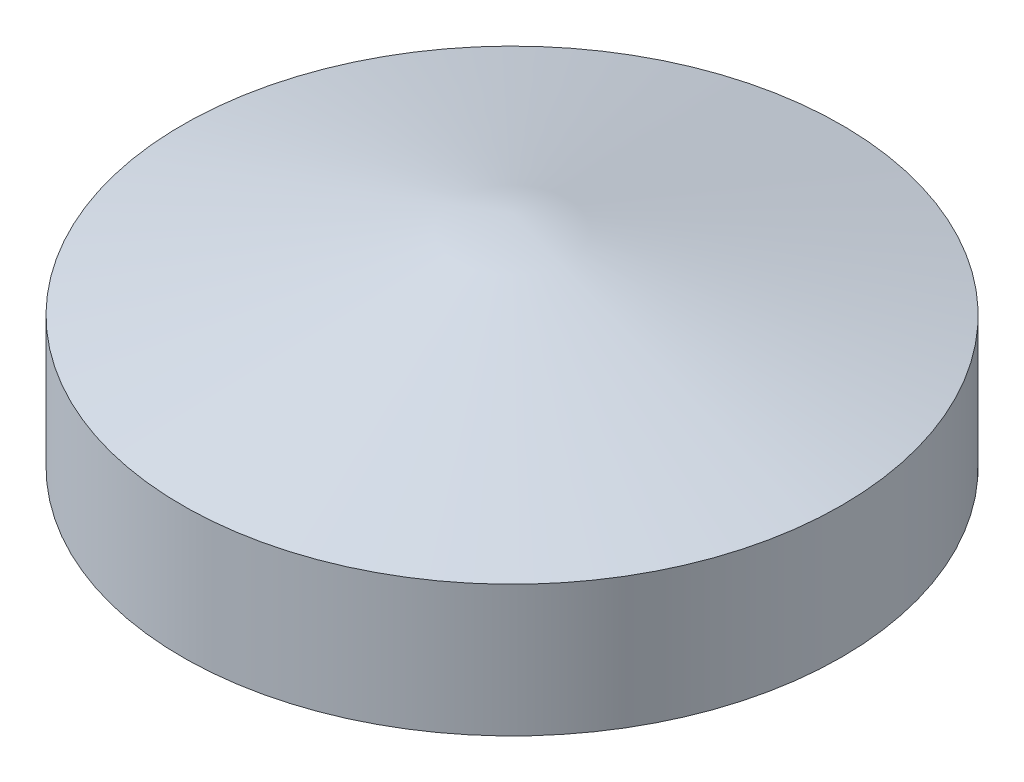
ISO-10303-21;
HEADER;
FILE_DESCRIPTION(('STEP AP214'),'2;1');
FILE_NAME('part.step','',(''),(''),'','','');
FILE_SCHEMA(('AUTOMOTIVE_DESIGN { 1 0 10303 214 1 1 1 1 }'));
ENDSEC;
DATA;
#1=APPLICATION_CONTEXT('core data for automotive mechanical design processes');
#2=APPLICATION_PROTOCOL_DEFINITION('international standard','automotive_design',2000,#1);
#3=PRODUCT_CONTEXT('',#1,'mechanical');
#4=PRODUCT('Part','Part','',(#3));
#5=PRODUCT_RELATED_PRODUCT_CATEGORY('part','',(#4));
#6=PRODUCT_DEFINITION_FORMATION('','',#4);
#7=PRODUCT_DEFINITION_CONTEXT('part definition',#1,'design');
#8=PRODUCT_DEFINITION('design','',#6,#7);
#9=PRODUCT_DEFINITION_SHAPE('','',#8);
#10=(LENGTH_UNIT() NAMED_UNIT(*) SI_UNIT(.MILLI.,.METRE.));
#11=(NAMED_UNIT(*) PLANE_ANGLE_UNIT() SI_UNIT($,.RADIAN.));
#12=(NAMED_UNIT(*) SI_UNIT($,.STERADIAN.) SOLID_ANGLE_UNIT());
#13=UNCERTAINTY_MEASURE_WITH_UNIT(LENGTH_MEASURE(1.E-05),#10,'distance_accuracy_value','');
#14=(GEOMETRIC_REPRESENTATION_CONTEXT(3) GLOBAL_UNCERTAINTY_ASSIGNED_CONTEXT((#13)) GLOBAL_UNIT_ASSIGNED_CONTEXT((#10,
#11,#12)) REPRESENTATION_CONTEXT('',''));
#15=CARTESIAN_POINT('',(0.,0.,0.));
#16=DIRECTION('',(0.,0.,1.));
#17=DIRECTION('',(1.,0.,0.));
#18=AXIS2_PLACEMENT_3D('',#15,#16,#17);
#19=CARTESIAN_POINT('',(0.,0.,0.));
#20=DIRECTION('',(0.,-1.,0.));
#21=DIRECTION('',(1.,0.,0.));
#22=AXIS2_PLACEMENT_3D('',#19,#20,#21);
#23=CYLINDRICAL_SURFACE('',#22,9.00000000000001);
#24=CARTESIAN_POINT('',(0.,1.17691453623971,0.));
#25=DIRECTION('',(0.,-1.,0.));
#26=DIRECTION('',(1.,0.,0.));
#27=AXIS2_PLACEMENT_3D('',#24,#25,#26);
#28=CIRCLE('',#27,9.);
#29=CARTESIAN_POINT('',(9.,1.17691453623971,0.));
#30=VERTEX_POINT('',#29);
#31=EDGE_CURVE('E44',#30,#30,#28,.T.);
#32=ORIENTED_EDGE('',*,*,#31,.T.);
#33=EDGE_LOOP('',(#32));
#34=FACE_BOUND('',#33,.T.);
#35=CARTESIAN_POINT('',(0.,-2.41154273188015,0.));
#36=DIRECTION('',(0.,-1.,0.));
#37=DIRECTION('',(1.,0.,0.));
#38=AXIS2_PLACEMENT_3D('',#35,#36,#37);
#39=CIRCLE('',#38,9.00000000000001);
#40=CARTESIAN_POINT('',(9.00000000000001,-2.41154273188015,0.));
#41=VERTEX_POINT('',#40);
#42=EDGE_CURVE('E11',#41,#41,#39,.T.);
#43=ORIENTED_EDGE('',*,*,#42,.F.);
#44=EDGE_LOOP('',(#43));
#45=FACE_BOUND('',#44,.T.);
#46=ADVANCED_FACE('F37',(#34,#45),#23,.T.);
#47=CARTESIAN_POINT('',(0.,0.,0.));
#48=DIRECTION('',(0.,-1.,0.));
#49=DIRECTION('',(1.,0.,0.));
#50=AXIS2_PLACEMENT_3D('',#47,#48,#49);
#51=CONICAL_SURFACE('',#50,0.,1.30899693899574);
#52=ORIENTED_EDGE('',*,*,#42,.T.);
#53=EDGE_LOOP('',(#52));
#54=FACE_BOUND('',#53,.T.);
#55=CARTESIAN_POINT('',(0.,0.,0.));
#56=VERTEX_POINT('',#55);
#57=VERTEX_LOOP('',#56);
#58=FACE_BOUND('',#57,.T.);
#59=ADVANCED_FACE('F50',(#54,#58),#51,.F.);
#60=CARTESIAN_POINT('',(0.,3.58845726811985,0.));
#61=DIRECTION('',(0.,-1.,0.));
#62=DIRECTION('',(1.,0.,0.));
#63=AXIS2_PLACEMENT_3D('',#60,#61,#62);
#64=CONICAL_SURFACE('',#63,0.,1.30899693899574);
#65=ORIENTED_EDGE('',*,*,#31,.F.);
#66=EDGE_LOOP('',(#65));
#67=FACE_BOUND('',#66,.T.);
#68=CARTESIAN_POINT('',(0.,3.58845726811985,0.));
#69=VERTEX_POINT('',#68);
#70=VERTEX_LOOP('',#69);
#71=FACE_BOUND('',#70,.T.);
#72=ADVANCED_FACE('F52',(#67,#71),#64,.T.);
#73=CLOSED_SHELL('',(#46,#59,#72));
#74=MANIFOLD_SOLID_BREP('B2',#73);
#75=ADVANCED_BREP_SHAPE_REPRESENTATION('',(#18,#74),#14);
#76=SHAPE_DEFINITION_REPRESENTATION(#9,#75);
ENDSEC;
END-ISO-10303-21;
